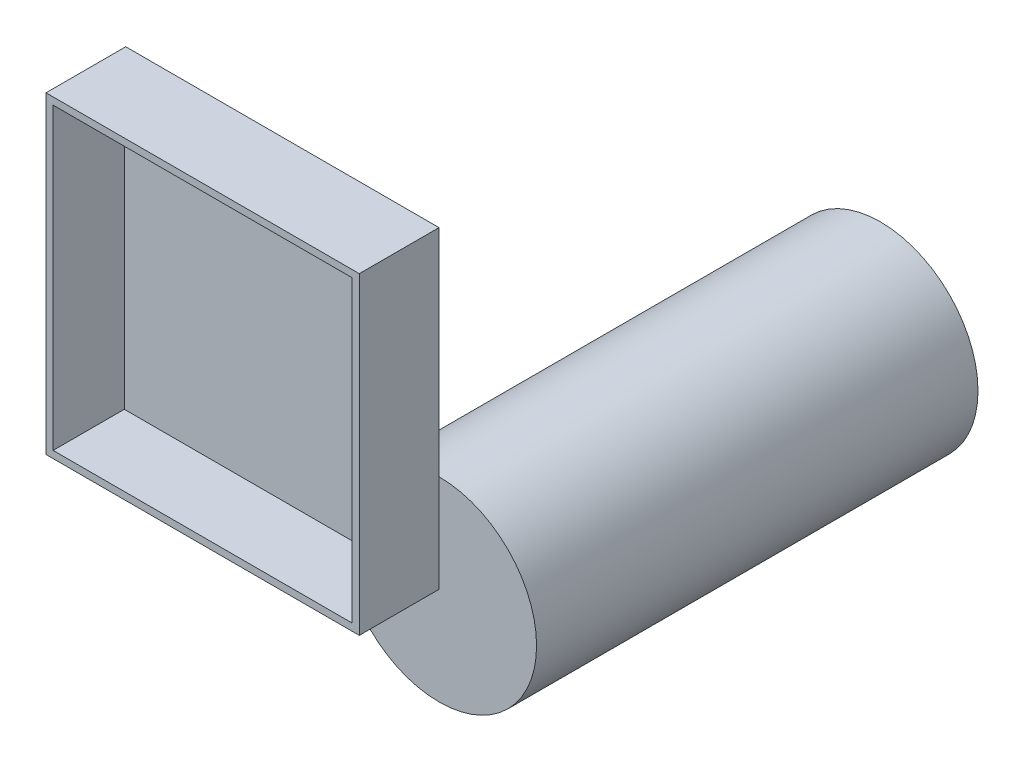
ISO-10303-21;
HEADER;
FILE_DESCRIPTION(('STEP AP214'),'2;1');
FILE_NAME('part.step','',(''),(''),'','','');
FILE_SCHEMA(('AUTOMOTIVE_DESIGN { 1 0 10303 214 1 1 1 1 }'));
ENDSEC;
DATA;
#1=APPLICATION_CONTEXT('core data for automotive mechanical design processes');
#2=APPLICATION_PROTOCOL_DEFINITION('international standard','automotive_design',2000,#1);
#3=PRODUCT_CONTEXT('',#1,'mechanical');
#4=PRODUCT('Part','Part','',(#3));
#5=PRODUCT_RELATED_PRODUCT_CATEGORY('part','',(#4));
#6=PRODUCT_DEFINITION_FORMATION('','',#4);
#7=PRODUCT_DEFINITION_CONTEXT('part definition',#1,'design');
#8=PRODUCT_DEFINITION('design','',#6,#7);
#9=PRODUCT_DEFINITION_SHAPE('','',#8);
#10=(LENGTH_UNIT() NAMED_UNIT(*) SI_UNIT(.MILLI.,.METRE.));
#11=(NAMED_UNIT(*) PLANE_ANGLE_UNIT() SI_UNIT($,.RADIAN.));
#12=(NAMED_UNIT(*) SI_UNIT($,.STERADIAN.) SOLID_ANGLE_UNIT());
#13=UNCERTAINTY_MEASURE_WITH_UNIT(LENGTH_MEASURE(1.E-05),#10,'distance_accuracy_value','');
#14=(GEOMETRIC_REPRESENTATION_CONTEXT(3) GLOBAL_UNCERTAINTY_ASSIGNED_CONTEXT((#13)) GLOBAL_UNIT_ASSIGNED_CONTEXT((#10,
#11,#12)) REPRESENTATION_CONTEXT('',''));
#15=CARTESIAN_POINT('',(0.,0.,0.));
#16=DIRECTION('',(0.,0.,1.));
#17=DIRECTION('',(1.,0.,0.));
#18=AXIS2_PLACEMENT_3D('',#15,#16,#17);
#19=CARTESIAN_POINT('',(0.,0.,0.));
#20=DIRECTION('',(0.,0.,1.));
#21=DIRECTION('',(1.,0.,0.));
#22=AXIS2_PLACEMENT_3D('',#19,#20,#21);
#23=PLANE('',#22);
#24=CARTESIAN_POINT('',(0.,0.,0.));
#25=DIRECTION('',(0.,0.,1.));
#26=DIRECTION('',(1.,0.,0.));
#27=AXIS2_PLACEMENT_3D('',#24,#25,#26);
#28=CIRCLE('',#27,34.25);
#29=CARTESIAN_POINT('',(34.25,0.,0.));
#30=VERTEX_POINT('',#29);
#31=EDGE_CURVE('E11',#30,#30,#28,.T.);
#32=ORIENTED_EDGE('',*,*,#31,.F.);
#33=EDGE_LOOP('',(#32));
#34=FACE_BOUND('',#33,.T.);
#35=CARTESIAN_POINT('',(0.,0.,0.));
#36=DIRECTION('',(0.,0.,1.));
#37=DIRECTION('',(1.,0.,0.));
#38=AXIS2_PLACEMENT_3D('',#35,#36,#37);
#39=CIRCLE('',#38,31.75);
#40=CARTESIAN_POINT('',(31.75,0.,0.));
#41=VERTEX_POINT('',#40);
#42=EDGE_CURVE('E41',#41,#41,#39,.T.);
#43=ORIENTED_EDGE('',*,*,#42,.T.);
#44=EDGE_LOOP('',(#43));
#45=FACE_BOUND('',#44,.T.);
#46=ADVANCED_FACE('F33',(#34,#45),#23,.F.);
#47=CARTESIAN_POINT('',(0.,0.,150.));
#48=DIRECTION('',(0.,0.,-1.));
#49=DIRECTION('',(-1.,0.,0.));
#50=AXIS2_PLACEMENT_3D('',#47,#48,#49);
#51=CYLINDRICAL_SURFACE('',#50,34.25);
#52=ORIENTED_EDGE('',*,*,#31,.T.);
#53=EDGE_LOOP('',(#52));
#54=FACE_BOUND('',#53,.T.);
#55=CARTESIAN_POINT('',(0.,0.,155.));
#56=DIRECTION('',(0.,0.,1.));
#57=DIRECTION('',(1.,0.,0.));
#58=AXIS2_PLACEMENT_3D('',#55,#56,#57);
#59=CIRCLE('',#58,34.25);
#60=CARTESIAN_POINT('',(0.,34.25,155.));
#61=VERTEX_POINT('',#60);
#62=CARTESIAN_POINT('',(-34.25,0.,155.));
#63=VERTEX_POINT('',#62);
#64=EDGE_CURVE('E180',#61,#63,#59,.T.);
#65=ORIENTED_EDGE('',*,*,#64,.F.);
#66=EDGE_CURVE('E179',#63,#61,#59,.T.);
#67=ORIENTED_EDGE('',*,*,#66,.F.);
#68=EDGE_LOOP('',(#65,#67));
#69=FACE_BOUND('',#68,.T.);
#70=ADVANCED_FACE('F35',(#54,#69),#51,.T.);
#71=CARTESIAN_POINT('',(0.,0.,150.));
#72=DIRECTION('',(0.,0.,-1.));
#73=DIRECTION('',(-1.,0.,0.));
#74=AXIS2_PLACEMENT_3D('',#71,#72,#73);
#75=CYLINDRICAL_SURFACE('',#74,31.75);
#76=CARTESIAN_POINT('',(0.,0.,150.));
#77=DIRECTION('',(0.,0.,1.));
#78=DIRECTION('',(1.,0.,0.));
#79=AXIS2_PLACEMENT_3D('',#76,#77,#78);
#80=CIRCLE('',#79,31.75);
#81=CARTESIAN_POINT('',(31.75,0.,150.));
#82=VERTEX_POINT('',#81);
#83=EDGE_CURVE('E182',#82,#82,#80,.T.);
#84=ORIENTED_EDGE('',*,*,#83,.T.);
#85=EDGE_LOOP('',(#84));
#86=FACE_BOUND('',#85,.T.);
#87=ORIENTED_EDGE('',*,*,#42,.F.);
#88=EDGE_LOOP('',(#87));
#89=FACE_BOUND('',#88,.T.);
#90=ADVANCED_FACE('F188',(#86,#89),#75,.F.);
#91=CARTESIAN_POINT('',(0.,0.,150.));
#92=DIRECTION('',(0.,0.,1.));
#93=DIRECTION('',(1.,0.,0.));
#94=AXIS2_PLACEMENT_3D('',#91,#92,#93);
#95=PLANE('',#94);
#96=ORIENTED_EDGE('',*,*,#83,.F.);
#97=EDGE_LOOP('',(#96));
#98=FACE_BOUND('',#97,.T.);
#99=ADVANCED_FACE('F190',(#98),#95,.F.);
#100=CARTESIAN_POINT('',(0.,0.,155.));
#101=DIRECTION('',(0.,0.,1.));
#102=DIRECTION('',(1.,0.,0.));
#103=AXIS2_PLACEMENT_3D('',#100,#101,#102);
#104=PLANE('',#103);
#105=DIRECTION('',(0.,1.,0.));
#106=VECTOR('',#105,1.);
#107=CARTESIAN_POINT('',(0.,0.,155.));
#108=LINE('',#107,#106);
#109=CARTESIAN_POINT('',(0.,0.,155.));
#110=VERTEX_POINT('',#109);
#111=EDGE_CURVE('E167',#110,#61,#108,.T.);
#112=ORIENTED_EDGE('',*,*,#111,.F.);
#113=DIRECTION('',(-1.,0.,0.));
#114=VECTOR('',#113,1.);
#115=CARTESIAN_POINT('',(0.,0.,155.));
#116=LINE('',#115,#114);
#117=EDGE_CURVE('E163',#110,#63,#116,.T.);
#118=ORIENTED_EDGE('',*,*,#117,.T.);
#119=ORIENTED_EDGE('',*,*,#66,.T.);
#120=EDGE_LOOP('',(#112,#118,#119));
#121=FACE_BOUND('',#120,.T.);
#122=ADVANCED_FACE('F197',(#121),#104,.T.);
#123=CARTESIAN_POINT('',(0.,110.,158.));
#124=DIRECTION('',(0.,-1.,0.));
#125=DIRECTION('',(0.,0.,-1.));
#126=AXIS2_PLACEMENT_3D('',#123,#124,#125);
#127=PLANE('',#126);
#128=DIRECTION('',(-1.,0.,0.));
#129=VECTOR('',#128,1.);
#130=CARTESIAN_POINT('',(0.,110.,155.));
#131=LINE('',#130,#129);
#132=CARTESIAN_POINT('',(0.,110.,155.));
#133=VERTEX_POINT('',#132);
#134=CARTESIAN_POINT('',(-110.,110.,155.));
#135=VERTEX_POINT('',#134);
#136=EDGE_CURVE('E157',#133,#135,#131,.T.);
#137=ORIENTED_EDGE('',*,*,#136,.T.);
#138=DIRECTION('',(0.,0.,-1.));
#139=VECTOR('',#138,1.);
#140=CARTESIAN_POINT('',(-110.,110.,158.));
#141=LINE('',#140,#139);
#142=CARTESIAN_POINT('',(-110.,110.,183.));
#143=VERTEX_POINT('',#142);
#144=EDGE_CURVE('E177',#143,#135,#141,.T.);
#145=ORIENTED_EDGE('',*,*,#144,.F.);
#146=DIRECTION('',(-1.,0.,0.));
#147=VECTOR('',#146,1.);
#148=CARTESIAN_POINT('',(0.,110.,183.));
#149=LINE('',#148,#147);
#150=CARTESIAN_POINT('',(0.,110.,183.));
#151=VERTEX_POINT('',#150);
#152=EDGE_CURVE('E154',#151,#143,#149,.T.);
#153=ORIENTED_EDGE('',*,*,#152,.F.);
#154=DIRECTION('',(0.,0.,-1.));
#155=VECTOR('',#154,1.);
#156=CARTESIAN_POINT('',(0.,110.,158.));
#157=LINE('',#156,#155);
#158=EDGE_CURVE('E170',#151,#133,#157,.T.);
#159=ORIENTED_EDGE('',*,*,#158,.T.);
#160=EDGE_LOOP('',(#137,#145,#153,#159));
#161=FACE_BOUND('',#160,.T.);
#162=ADVANCED_FACE('F224',(#161),#127,.F.);
#163=CARTESIAN_POINT('',(-110.,0.,158.));
#164=DIRECTION('',(-1.,0.,0.));
#165=DIRECTION('',(0.,0.,1.));
#166=AXIS2_PLACEMENT_3D('',#163,#164,#165);
#167=PLANE('',#166);
#168=DIRECTION('',(0.,1.,0.));
#169=VECTOR('',#168,1.);
#170=CARTESIAN_POINT('',(-110.,0.,155.));
#171=LINE('',#170,#169);
#172=CARTESIAN_POINT('',(-110.,0.,155.));
#173=VERTEX_POINT('',#172);
#174=EDGE_CURVE('E160',#173,#135,#171,.T.);
#175=ORIENTED_EDGE('',*,*,#174,.F.);
#176=DIRECTION('',(0.,0.,-1.));
#177=VECTOR('',#176,1.);
#178=CARTESIAN_POINT('',(-110.,0.,158.));
#179=LINE('',#178,#177);
#180=CARTESIAN_POINT('',(-110.,0.,183.));
#181=VERTEX_POINT('',#180);
#182=EDGE_CURVE('E175',#181,#173,#179,.T.);
#183=ORIENTED_EDGE('',*,*,#182,.F.);
#184=DIRECTION('',(0.,-1.,0.));
#185=VECTOR('',#184,1.);
#186=CARTESIAN_POINT('',(-110.,0.,183.));
#187=LINE('',#186,#185);
#188=EDGE_CURVE('E122',#143,#181,#187,.T.);
#189=ORIENTED_EDGE('',*,*,#188,.F.);
#190=ORIENTED_EDGE('',*,*,#144,.T.);
#191=EDGE_LOOP('',(#175,#183,#189,#190));
#192=FACE_BOUND('',#191,.T.);
#193=ADVANCED_FACE('F227',(#192),#167,.T.);
#194=CARTESIAN_POINT('',(0.,0.,158.));
#195=DIRECTION('',(0.,-1.,0.));
#196=DIRECTION('',(1.,0.,0.));
#197=AXIS2_PLACEMENT_3D('',#194,#195,#196);
#198=PLANE('',#197);
#199=ORIENTED_EDGE('',*,*,#117,.F.);
#200=DIRECTION('',(0.,0.,-1.));
#201=VECTOR('',#200,1.);
#202=CARTESIAN_POINT('',(0.,0.,158.));
#203=LINE('',#202,#201);
#204=CARTESIAN_POINT('',(0.,0.,183.));
#205=VERTEX_POINT('',#204);
#206=EDGE_CURVE('E173',#205,#110,#203,.T.);
#207=ORIENTED_EDGE('',*,*,#206,.F.);
#208=DIRECTION('',(1.,0.,0.));
#209=VECTOR('',#208,1.);
#210=CARTESIAN_POINT('',(-110.,0.,183.));
#211=LINE('',#210,#209);
#212=EDGE_CURVE('E148',#181,#205,#211,.T.);
#213=ORIENTED_EDGE('',*,*,#212,.F.);
#214=ORIENTED_EDGE('',*,*,#182,.T.);
#215=EDGE_CURVE('E56',#63,#173,#116,.T.);
#216=ORIENTED_EDGE('',*,*,#215,.F.);
#217=EDGE_LOOP('',(#199,#207,#213,#214,#216));
#218=FACE_BOUND('',#217,.T.);
#219=ADVANCED_FACE('F215',(#218),#198,.T.);
#220=CARTESIAN_POINT('',(0.,0.,158.));
#221=DIRECTION('',(-1.,0.,0.));
#222=DIRECTION('',(0.,0.,1.));
#223=AXIS2_PLACEMENT_3D('',#220,#221,#222);
#224=PLANE('',#223);
#225=ORIENTED_EDGE('',*,*,#111,.T.);
#226=EDGE_CURVE('E166',#61,#133,#108,.T.);
#227=ORIENTED_EDGE('',*,*,#226,.T.);
#228=ORIENTED_EDGE('',*,*,#158,.F.);
#229=DIRECTION('',(0.,1.,0.));
#230=VECTOR('',#229,1.);
#231=CARTESIAN_POINT('',(0.,0.,183.));
#232=LINE('',#231,#230);
#233=EDGE_CURVE('E151',#205,#151,#232,.T.);
#234=ORIENTED_EDGE('',*,*,#233,.F.);
#235=ORIENTED_EDGE('',*,*,#206,.T.);
#236=EDGE_LOOP('',(#225,#227,#228,#234,#235));
#237=FACE_BOUND('',#236,.T.);
#238=ADVANCED_FACE('F222',(#237),#224,.F.);
#239=CARTESIAN_POINT('',(0.,0.,155.));
#240=DIRECTION('',(0.,0.,-1.));
#241=DIRECTION('',(-1.,0.,0.));
#242=AXIS2_PLACEMENT_3D('',#239,#240,#241);
#243=PLANE('',#242);
#244=ORIENTED_EDGE('',*,*,#226,.F.);
#245=ORIENTED_EDGE('',*,*,#64,.T.);
#246=ORIENTED_EDGE('',*,*,#215,.T.);
#247=ORIENTED_EDGE('',*,*,#174,.T.);
#248=ORIENTED_EDGE('',*,*,#136,.F.);
#249=EDGE_LOOP('',(#244,#245,#246,#247,#248));
#250=FACE_BOUND('',#249,.T.);
#251=ADVANCED_FACE('F211',(#250),#243,.T.);
#252=CARTESIAN_POINT('',(0.,0.,183.));
#253=DIRECTION('',(0.,0.,1.));
#254=DIRECTION('',(1.,0.,0.));
#255=AXIS2_PLACEMENT_3D('',#252,#253,#254);
#256=PLANE('',#255);
#257=ORIENTED_EDGE('',*,*,#188,.T.);
#258=ORIENTED_EDGE('',*,*,#212,.T.);
#259=ORIENTED_EDGE('',*,*,#233,.T.);
#260=ORIENTED_EDGE('',*,*,#152,.T.);
#261=EDGE_LOOP('',(#257,#258,#259,#260));
#262=FACE_BOUND('',#261,.T.);
#263=DIRECTION('',(1.,0.,0.));
#264=VECTOR('',#263,1.);
#265=CARTESIAN_POINT('',(-2.49999999999998,2.5,183.));
#266=LINE('',#265,#264);
#267=CARTESIAN_POINT('',(-107.5,2.49999999999999,183.));
#268=VERTEX_POINT('',#267);
#269=CARTESIAN_POINT('',(-2.49999999999998,2.5,183.));
#270=VERTEX_POINT('',#269);
#271=EDGE_CURVE('E114',#268,#270,#266,.T.);
#272=ORIENTED_EDGE('',*,*,#271,.F.);
#273=DIRECTION('',(0.,-1.,0.));
#274=VECTOR('',#273,1.);
#275=CARTESIAN_POINT('',(-107.5,2.49999999999999,183.));
#276=LINE('',#275,#274);
#277=CARTESIAN_POINT('',(-107.5,107.5,183.));
#278=VERTEX_POINT('',#277);
#279=EDGE_CURVE('E106',#278,#268,#276,.T.);
#280=ORIENTED_EDGE('',*,*,#279,.F.);
#281=DIRECTION('',(-1.,0.,0.));
#282=VECTOR('',#281,1.);
#283=CARTESIAN_POINT('',(-2.49999999999999,107.5,183.));
#284=LINE('',#283,#282);
#285=CARTESIAN_POINT('',(-2.49999999999999,107.5,183.));
#286=VERTEX_POINT('',#285);
#287=EDGE_CURVE('E130',#286,#278,#284,.T.);
#288=ORIENTED_EDGE('',*,*,#287,.F.);
#289=DIRECTION('',(0.,1.,0.));
#290=VECTOR('',#289,1.);
#291=CARTESIAN_POINT('',(-2.49999999999998,2.5,183.));
#292=LINE('',#291,#290);
#293=EDGE_CURVE('E128',#270,#286,#292,.T.);
#294=ORIENTED_EDGE('',*,*,#293,.F.);
#295=EDGE_LOOP('',(#272,#280,#288,#294));
#296=FACE_BOUND('',#295,.T.);
#297=ADVANCED_FACE('F126',(#262,#296),#256,.T.);
#298=CARTESIAN_POINT('',(-107.5,2.49999999999999,183.));
#299=DIRECTION('',(1.,0.,0.));
#300=DIRECTION('',(0.,1.,0.));
#301=AXIS2_PLACEMENT_3D('',#298,#299,#300);
#302=PLANE('',#301);
#303=DIRECTION('',(0.,-1.,0.));
#304=VECTOR('',#303,1.);
#305=CARTESIAN_POINT('',(-107.5,2.49999999999999,158.));
#306=LINE('',#305,#304);
#307=CARTESIAN_POINT('',(-107.5,107.5,158.));
#308=VERTEX_POINT('',#307);
#309=CARTESIAN_POINT('',(-107.5,2.49999999999999,158.));
#310=VERTEX_POINT('',#309);
#311=EDGE_CURVE('E134',#308,#310,#306,.T.);
#312=ORIENTED_EDGE('',*,*,#311,.F.);
#313=DIRECTION('',(0.,0.,-1.));
#314=VECTOR('',#313,1.);
#315=CARTESIAN_POINT('',(-107.5,107.5,183.));
#316=LINE('',#315,#314);
#317=EDGE_CURVE('E48',#278,#308,#316,.T.);
#318=ORIENTED_EDGE('',*,*,#317,.F.);
#319=ORIENTED_EDGE('',*,*,#279,.T.);
#320=DIRECTION('',(0.,0.,-1.));
#321=VECTOR('',#320,1.);
#322=CARTESIAN_POINT('',(-107.5,2.49999999999999,183.));
#323=LINE('',#322,#321);
#324=EDGE_CURVE('E109',#268,#310,#323,.T.);
#325=ORIENTED_EDGE('',*,*,#324,.T.);
#326=EDGE_LOOP('',(#312,#318,#319,#325));
#327=FACE_BOUND('',#326,.T.);
#328=ADVANCED_FACE('F108',(#327),#302,.T.);
#329=CARTESIAN_POINT('',(-2.49999999999998,2.5,183.));
#330=DIRECTION('',(0.,1.,0.));
#331=DIRECTION('',(-1.,0.,0.));
#332=AXIS2_PLACEMENT_3D('',#329,#330,#331);
#333=PLANE('',#332);
#334=DIRECTION('',(1.,0.,0.));
#335=VECTOR('',#334,1.);
#336=CARTESIAN_POINT('',(-2.49999999999998,2.5,158.));
#337=LINE('',#336,#335);
#338=CARTESIAN_POINT('',(-2.49999999999998,2.5,158.));
#339=VERTEX_POINT('',#338);
#340=EDGE_CURVE('E121',#310,#339,#337,.T.);
#341=ORIENTED_EDGE('',*,*,#340,.F.);
#342=ORIENTED_EDGE('',*,*,#324,.F.);
#343=ORIENTED_EDGE('',*,*,#271,.T.);
#344=DIRECTION('',(0.,0.,-1.));
#345=VECTOR('',#344,1.);
#346=CARTESIAN_POINT('',(-2.49999999999998,2.5,183.));
#347=LINE('',#346,#345);
#348=EDGE_CURVE('E123',#270,#339,#347,.T.);
#349=ORIENTED_EDGE('',*,*,#348,.T.);
#350=EDGE_LOOP('',(#341,#342,#343,#349));
#351=FACE_BOUND('',#350,.T.);
#352=ADVANCED_FACE('F118',(#351),#333,.T.);
#353=CARTESIAN_POINT('',(-2.49999999999998,2.5,183.));
#354=DIRECTION('',(-1.,0.,0.));
#355=DIRECTION('',(0.,-1.,0.));
#356=AXIS2_PLACEMENT_3D('',#353,#354,#355);
#357=PLANE('',#356);
#358=DIRECTION('',(0.,1.,0.));
#359=VECTOR('',#358,1.);
#360=CARTESIAN_POINT('',(-2.49999999999998,2.5,158.));
#361=LINE('',#360,#359);
#362=CARTESIAN_POINT('',(-2.49999999999999,107.5,158.));
#363=VERTEX_POINT('',#362);
#364=EDGE_CURVE('E137',#339,#363,#361,.T.);
#365=ORIENTED_EDGE('',*,*,#364,.F.);
#366=ORIENTED_EDGE('',*,*,#348,.F.);
#367=ORIENTED_EDGE('',*,*,#293,.T.);
#368=DIRECTION('',(0.,0.,-1.));
#369=VECTOR('',#368,1.);
#370=CARTESIAN_POINT('',(-2.49999999999999,107.5,183.));
#371=LINE('',#370,#369);
#372=EDGE_CURVE('E143',#286,#363,#371,.T.);
#373=ORIENTED_EDGE('',*,*,#372,.T.);
#374=EDGE_LOOP('',(#365,#366,#367,#373));
#375=FACE_BOUND('',#374,.T.);
#376=ADVANCED_FACE('F298',(#375),#357,.T.);
#377=CARTESIAN_POINT('',(-2.49999999999999,107.5,183.));
#378=DIRECTION('',(0.,-1.,0.));
#379=DIRECTION('',(1.,0.,0.));
#380=AXIS2_PLACEMENT_3D('',#377,#378,#379);
#381=PLANE('',#380);
#382=DIRECTION('',(-1.,0.,0.));
#383=VECTOR('',#382,1.);
#384=CARTESIAN_POINT('',(-2.49999999999999,107.5,158.));
#385=LINE('',#384,#383);
#386=EDGE_CURVE('E115',#363,#308,#385,.T.);
#387=ORIENTED_EDGE('',*,*,#386,.F.);
#388=ORIENTED_EDGE('',*,*,#372,.F.);
#389=ORIENTED_EDGE('',*,*,#287,.T.);
#390=ORIENTED_EDGE('',*,*,#317,.T.);
#391=EDGE_LOOP('',(#387,#388,#389,#390));
#392=FACE_BOUND('',#391,.T.);
#393=ADVANCED_FACE('F307',(#392),#381,.T.);
#394=CARTESIAN_POINT('',(0.,0.,158.));
#395=DIRECTION('',(0.,0.,-1.));
#396=DIRECTION('',(-1.,0.,0.));
#397=AXIS2_PLACEMENT_3D('',#394,#395,#396);
#398=PLANE('',#397);
#399=ORIENTED_EDGE('',*,*,#386,.T.);
#400=ORIENTED_EDGE('',*,*,#311,.T.);
#401=ORIENTED_EDGE('',*,*,#340,.T.);
#402=ORIENTED_EDGE('',*,*,#364,.T.);
#403=EDGE_LOOP('',(#399,#400,#401,#402));
#404=FACE_BOUND('',#403,.T.);
#405=ADVANCED_FACE('F317',(#404),#398,.F.);
#406=CLOSED_SHELL('',(#46,#70,#90,#99,#122,#162,#193,#219,#238,#251,#297,#328,#352,#376,#393,#405));
#407=MANIFOLD_SOLID_BREP('B2',#406);
#408=ADVANCED_BREP_SHAPE_REPRESENTATION('',(#18,#407),#14);
#409=SHAPE_DEFINITION_REPRESENTATION(#9,#408);
ENDSEC;
END-ISO-10303-21;
